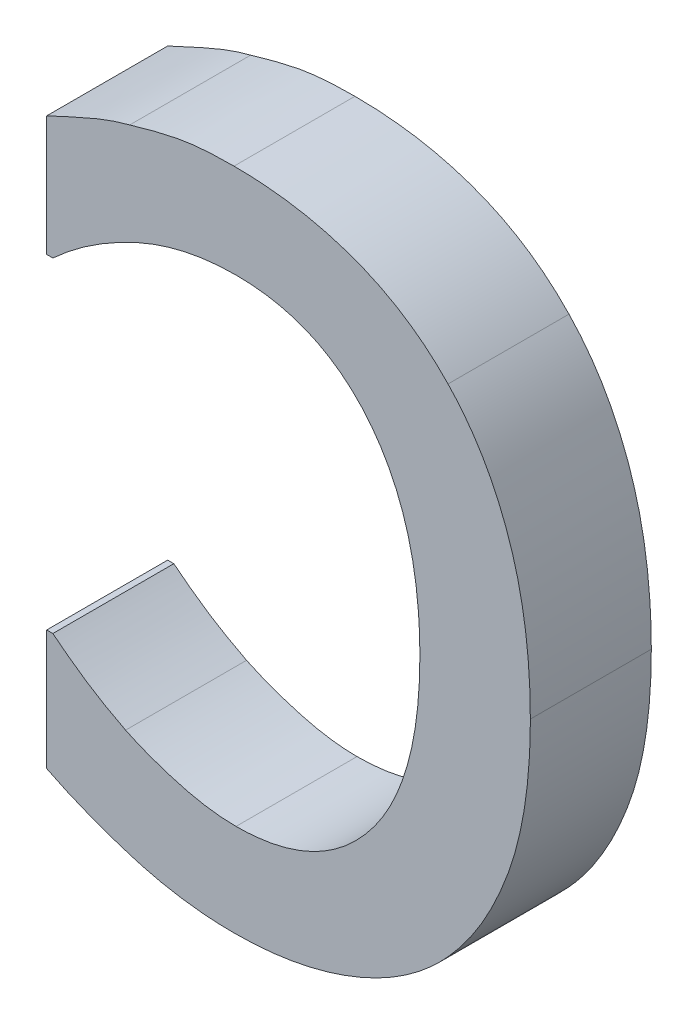
ISO-10303-21;
HEADER;
FILE_DESCRIPTION(('STEP AP214'),'2;1');
FILE_NAME('part.step','',(''),(''),'','','');
FILE_SCHEMA(('AUTOMOTIVE_DESIGN { 1 0 10303 214 1 1 1 1 }'));
ENDSEC;
DATA;
#1=APPLICATION_CONTEXT('core data for automotive mechanical design processes');
#2=APPLICATION_PROTOCOL_DEFINITION('international standard','automotive_design',2000,#1);
#3=PRODUCT_CONTEXT('',#1,'mechanical');
#4=PRODUCT('Part','Part','',(#3));
#5=PRODUCT_RELATED_PRODUCT_CATEGORY('part','',(#4));
#6=PRODUCT_DEFINITION_FORMATION('','',#4);
#7=PRODUCT_DEFINITION_CONTEXT('part definition',#1,'design');
#8=PRODUCT_DEFINITION('design','',#6,#7);
#9=PRODUCT_DEFINITION_SHAPE('','',#8);
#10=(LENGTH_UNIT() NAMED_UNIT(*) SI_UNIT(.MILLI.,.METRE.));
#11=(NAMED_UNIT(*) PLANE_ANGLE_UNIT() SI_UNIT($,.RADIAN.));
#12=(NAMED_UNIT(*) SI_UNIT($,.STERADIAN.) SOLID_ANGLE_UNIT());
#13=UNCERTAINTY_MEASURE_WITH_UNIT(LENGTH_MEASURE(1.E-05),#10,'distance_accuracy_value','');
#14=(GEOMETRIC_REPRESENTATION_CONTEXT(3) GLOBAL_UNCERTAINTY_ASSIGNED_CONTEXT((#13)) GLOBAL_UNIT_ASSIGNED_CONTEXT((#10,
#11,#12)) REPRESENTATION_CONTEXT('',''));
#15=CARTESIAN_POINT('',(0.,0.,0.));
#16=DIRECTION('',(0.,0.,1.));
#17=DIRECTION('',(1.,0.,0.));
#18=AXIS2_PLACEMENT_3D('',#15,#16,#17);
#19=CARTESIAN_POINT('',(-1.423104974207,1.022916597016,0.));
#20=CARTESIAN_POINT('',(-1.423104974207,1.022916597016,0.1));
#21=CARTESIAN_POINT('',(-1.423104974207,1.09210661708,0.));
#22=CARTESIAN_POINT('',(-1.423104974207,1.09210661708,0.1));
#23=CARTESIAN_POINT('',(-1.458834246864,1.195324515865,0.));
#24=CARTESIAN_POINT('',(-1.458834246864,1.195324515865,0.1));
#25=CARTESIAN_POINT('',(-1.491160731648,1.228785263273,0.));
#26=CARTESIAN_POINT('',(-1.491160731648,1.228785263273,0.1));
#27=B_SPLINE_SURFACE_WITH_KNOTS('',2,1,((#19,#20),(#21,#22),(#23,#24),(#25,#26)),.UNSPECIFIED.,
.F.,.F.,.F.,(3,1,3),(2,2),(-2.,-1.,0.),(0.,0.01),.UNSPECIFIED.);
#28=CARTESIAN_POINT('',(-1.491160731648,1.228785263273,0.));
#29=CARTESIAN_POINT('',(-1.458834246864,1.195324515865,0.));
#30=CARTESIAN_POINT('',(-1.423104974207,1.09210661708,0.));
#31=CARTESIAN_POINT('',(-1.423104974207,1.022916597016,0.));
#32=B_SPLINE_CURVE_WITH_KNOTS('',2,(#28,#29,#30,#31),.UNSPECIFIED.,.F.,.F.,(3,1,3),(0.,1.,2.),.UNSPECIFIED.);
#33=CARTESIAN_POINT('',(-1.491160731648,1.228785263273,0.));
#34=VERTEX_POINT('',#33);
#35=CARTESIAN_POINT('',(-1.423104974207,1.022916597016,0.));
#36=VERTEX_POINT('',#35);
#37=EDGE_CURVE('E11',#34,#36,#32,.T.);
#38=DIRECTION('',(0.,0.,1.));
#39=VECTOR('',#38,1.);
#40=CARTESIAN_POINT('',(-1.491160731648,1.228785263273,0.));
#41=LINE('',#40,#39);
#42=CARTESIAN_POINT('',(-1.491160731648,1.228785263273,0.1));
#43=VERTEX_POINT('',#42);
#44=EDGE_CURVE('E28',#34,#43,#41,.T.);
#45=CARTESIAN_POINT('',(-1.423104974207,1.022916597016,0.1));
#46=CARTESIAN_POINT('',(-1.423104974207,1.09210661708,0.1));
#47=CARTESIAN_POINT('',(-1.458834246864,1.195324515865,0.1));
#48=CARTESIAN_POINT('',(-1.491160731648,1.228785263273,0.1));
#49=B_SPLINE_CURVE_WITH_KNOTS('',2,(#45,#46,#47,#48),.UNSPECIFIED.,.F.,.F.,(3,1,3),(-2.,-1.,0.),.UNSPECIFIED.);
#50=CARTESIAN_POINT('',(-1.423104974207,1.022916597016,0.1));
#51=VERTEX_POINT('',#50);
#52=EDGE_CURVE('E152',#51,#43,#49,.T.);
#53=DIRECTION('',(0.,0.,1.));
#54=VECTOR('',#53,1.);
#55=CARTESIAN_POINT('',(-1.423104974207,1.022916597016,0.));
#56=LINE('',#55,#54);
#57=EDGE_CURVE('E364',#36,#51,#56,.T.);
#58=ORIENTED_EDGE('',*,*,#37,.F.);
#59=ORIENTED_EDGE('',*,*,#44,.T.);
#60=ORIENTED_EDGE('',*,*,#52,.F.);
#61=ORIENTED_EDGE('',*,*,#57,.F.);
#62=EDGE_LOOP('',(#58,#59,#60,#61));
#63=FACE_BOUND('',#62,.T.);
#64=ADVANCED_FACE('F17',(#63),#27,.T.);
#65=CARTESIAN_POINT('',(-1.491160731648,0.818749324693508,0.));
#66=CARTESIAN_POINT('',(-1.491160731648,0.818749324693508,0.1));
#67=CARTESIAN_POINT('',(-1.459968509488,0.852777203413839,0.));
#68=CARTESIAN_POINT('',(-1.459968509488,0.852777203413839,0.1));
#69=CARTESIAN_POINT('',(-1.423104974207,0.953726576950822,0.));
#70=CARTESIAN_POINT('',(-1.423104974207,0.953726576950822,0.1));
#71=CARTESIAN_POINT('',(-1.423104974207,1.022916597016,0.));
#72=CARTESIAN_POINT('',(-1.423104974207,1.022916597016,0.1));
#73=B_SPLINE_SURFACE_WITH_KNOTS('',2,1,((#65,#66),(#67,#68),(#69,#70),(#71,#72)),.UNSPECIFIED.,
.F.,.F.,.F.,(3,1,3),(2,2),(-2.,-1.,0.),(0.,0.01),.UNSPECIFIED.);
#74=CARTESIAN_POINT('',(-1.423104974207,1.022916597016,0.));
#75=CARTESIAN_POINT('',(-1.423104974207,0.953726576950822,0.));
#76=CARTESIAN_POINT('',(-1.459968509488,0.852777203413839,0.));
#77=CARTESIAN_POINT('',(-1.491160731648,0.818749324693508,0.));
#78=B_SPLINE_CURVE_WITH_KNOTS('',2,(#74,#75,#76,#77),.UNSPECIFIED.,.F.,.F.,(3,1,3),(0.,1.,2.),.UNSPECIFIED.);
#79=CARTESIAN_POINT('',(-1.491160731648,0.818749324693508,0.));
#80=VERTEX_POINT('',#79);
#81=EDGE_CURVE('E357',#36,#80,#78,.T.);
#82=CARTESIAN_POINT('',(-1.491160731648,0.818749324693508,0.1));
#83=CARTESIAN_POINT('',(-1.459968509488,0.852777203413839,0.1));
#84=CARTESIAN_POINT('',(-1.423104974207,0.953726576950822,0.1));
#85=CARTESIAN_POINT('',(-1.423104974207,1.022916597016,0.1));
#86=B_SPLINE_CURVE_WITH_KNOTS('',2,(#82,#83,#84,#85),.UNSPECIFIED.,.F.,.F.,(3,1,3),(-2.,-1.,0.),.UNSPECIFIED.);
#87=CARTESIAN_POINT('',(-1.491160731648,0.818749324693508,0.1));
#88=VERTEX_POINT('',#87);
#89=EDGE_CURVE('E353',#88,#51,#86,.T.);
#90=DIRECTION('',(0.,0.,1.));
#91=VECTOR('',#90,1.);
#92=CARTESIAN_POINT('',(-1.491160731648,0.818749324693508,0.));
#93=LINE('',#92,#91);
#94=EDGE_CURVE('E347',#80,#88,#93,.T.);
#95=ORIENTED_EDGE('',*,*,#81,.F.);
#96=ORIENTED_EDGE('',*,*,#57,.T.);
#97=ORIENTED_EDGE('',*,*,#89,.F.);
#98=ORIENTED_EDGE('',*,*,#94,.F.);
#99=EDGE_LOOP('',(#95,#96,#97,#98));
#100=FACE_BOUND('',#99,.T.);
#101=ADVANCED_FACE('F426',(#100),#73,.T.);
#102=CARTESIAN_POINT('',(-1.668105700994,0.747290779380812,0.));
#103=CARTESIAN_POINT('',(-1.668105700994,0.747290779380812,0.1));
#104=CARTESIAN_POINT('',(-1.614795357665,0.747290779380812,0.));
#105=CARTESIAN_POINT('',(-1.614795357665,0.747290779380812,0.1));
#106=CARTESIAN_POINT('',(-1.522352953808,0.784154314661171,0.));
#107=CARTESIAN_POINT('',(-1.522352953808,0.784154314661171,0.1));
#108=CARTESIAN_POINT('',(-1.491160731648,0.818749324693508,0.));
#109=CARTESIAN_POINT('',(-1.491160731648,0.818749324693508,0.1));
#110=B_SPLINE_SURFACE_WITH_KNOTS('',2,1,((#102,#103),(#104,#105),(#106,#107),(#108,#109)),
.UNSPECIFIED.,.F.,.F.,.F.,(3,1,3),(2,2),(-2.,-1.,0.),(0.,0.01),.UNSPECIFIED.);
#111=CARTESIAN_POINT('',(-1.491160731648,0.818749324693508,0.));
#112=CARTESIAN_POINT('',(-1.522352953808,0.784154314661171,0.));
#113=CARTESIAN_POINT('',(-1.614795357665,0.747290779380812,0.));
#114=CARTESIAN_POINT('',(-1.668105700994,0.747290779380812,0.));
#115=B_SPLINE_CURVE_WITH_KNOTS('',2,(#111,#112,#113,#114),.UNSPECIFIED.,.F.,.F.,(3,1,3),(0.,1.,
2.),.UNSPECIFIED.);
#116=CARTESIAN_POINT('',(-1.668105700994,0.747290779380812,0.));
#117=VERTEX_POINT('',#116);
#118=EDGE_CURVE('E340',#80,#117,#115,.T.);
#119=CARTESIAN_POINT('',(-1.668105700994,0.747290779380812,0.1));
#120=CARTESIAN_POINT('',(-1.614795357665,0.747290779380812,0.1));
#121=CARTESIAN_POINT('',(-1.522352953808,0.784154314661171,0.1));
#122=CARTESIAN_POINT('',(-1.491160731648,0.818749324693508,0.1));
#123=B_SPLINE_CURVE_WITH_KNOTS('',2,(#119,#120,#121,#122),.UNSPECIFIED.,.F.,.F.,(3,1,3),(-2.,
-1.,0.),.UNSPECIFIED.);
#124=CARTESIAN_POINT('',(-1.668105700994,0.747290779380812,0.1));
#125=VERTEX_POINT('',#124);
#126=EDGE_CURVE('E335',#125,#88,#123,.T.);
#127=DIRECTION('',(0.,0.,1.));
#128=VECTOR('',#127,1.);
#129=CARTESIAN_POINT('',(-1.668105700994,0.747290779380812,0.));
#130=LINE('',#129,#128);
#131=EDGE_CURVE('E329',#117,#125,#130,.T.);
#132=ORIENTED_EDGE('',*,*,#118,.F.);
#133=ORIENTED_EDGE('',*,*,#94,.T.);
#134=ORIENTED_EDGE('',*,*,#126,.F.);
#135=ORIENTED_EDGE('',*,*,#131,.F.);
#136=EDGE_LOOP('',(#132,#133,#134,#135));
#137=FACE_BOUND('',#136,.T.);
#138=ADVANCED_FACE('F422',(#137),#110,.T.);
#139=CARTESIAN_POINT('',(-1.822932549171,0.787557102533204,0.));
#140=CARTESIAN_POINT('',(-1.822932549171,0.787557102533204,0.1));
#141=CARTESIAN_POINT('',(-1.791740327011,0.771677425797049,0.));
#142=CARTESIAN_POINT('',(-1.791740327011,0.771677425797049,0.1));
#143=CARTESIAN_POINT('',(-1.711207680706,0.747290779380812,0.));
#144=CARTESIAN_POINT('',(-1.711207680706,0.747290779380812,0.1));
#145=CARTESIAN_POINT('',(-1.668105700994,0.747290779380812,0.));
#146=CARTESIAN_POINT('',(-1.668105700994,0.747290779380812,0.1));
#147=B_SPLINE_SURFACE_WITH_KNOTS('',2,1,((#139,#140),(#141,#142),(#143,#144),(#145,#146)),
.UNSPECIFIED.,.F.,.F.,.F.,(3,1,3),(2,2),(-2.,-1.,0.),(0.,0.01),.UNSPECIFIED.);
#148=CARTESIAN_POINT('',(-1.668105700994,0.747290779380812,0.));
#149=CARTESIAN_POINT('',(-1.711207680706,0.747290779380812,0.));
#150=CARTESIAN_POINT('',(-1.791740327011,0.771677425797049,0.));
#151=CARTESIAN_POINT('',(-1.822932549171,0.787557102533204,0.));
#152=B_SPLINE_CURVE_WITH_KNOTS('',2,(#148,#149,#150,#151),.UNSPECIFIED.,.F.,.F.,(3,1,3),(0.,1.,
2.),.UNSPECIFIED.);
#153=CARTESIAN_POINT('',(-1.822932549171,0.787557102533204,0.));
#154=VERTEX_POINT('',#153);
#155=EDGE_CURVE('E322',#117,#154,#152,.T.);
#156=CARTESIAN_POINT('',(-1.822932549171,0.787557102533204,0.1));
#157=CARTESIAN_POINT('',(-1.791740327011,0.771677425797049,0.1));
#158=CARTESIAN_POINT('',(-1.711207680706,0.747290779380812,0.1));
#159=CARTESIAN_POINT('',(-1.668105700994,0.747290779380812,0.1));
#160=B_SPLINE_CURVE_WITH_KNOTS('',2,(#156,#157,#158,#159),.UNSPECIFIED.,.F.,.F.,(3,1,3),(-2.,
-1.,0.),.UNSPECIFIED.);
#161=CARTESIAN_POINT('',(-1.822932549171,0.787557102533204,0.1));
#162=VERTEX_POINT('',#161);
#163=EDGE_CURVE('E317',#162,#125,#160,.T.);
#164=DIRECTION('',(0.,0.,1.));
#165=VECTOR('',#164,1.);
#166=CARTESIAN_POINT('',(-1.822932549171,0.787557102533204,0.));
#167=LINE('',#166,#165);
#168=EDGE_CURVE('E314',#154,#162,#167,.T.);
#169=ORIENTED_EDGE('',*,*,#155,.F.);
#170=ORIENTED_EDGE('',*,*,#131,.T.);
#171=ORIENTED_EDGE('',*,*,#163,.F.);
#172=ORIENTED_EDGE('',*,*,#168,.F.);
#173=EDGE_LOOP('',(#169,#170,#171,#172));
#174=FACE_BOUND('',#173,.T.);
#175=ADVANCED_FACE('F418',(#174),#147,.T.);
#176=CARTESIAN_POINT('',(-1.822932549171,0.886805082134171,0.));
#177=DIRECTION('',(-1.,0.,0.));
#178=DIRECTION('',(0.,-1.,0.));
#179=AXIS2_PLACEMENT_3D('',#176,#177,#178);
#180=PLANE('',#179);
#181=DIRECTION('',(0.,1.,0.));
#182=VECTOR('',#181,1.);
#183=CARTESIAN_POINT('',(-1.822932549171,0.787557102533204,0.));
#184=LINE('',#183,#182);
#185=CARTESIAN_POINT('',(-1.822932549171,0.886805082134171,0.));
#186=VERTEX_POINT('',#185);
#187=EDGE_CURVE('E312',#154,#186,#184,.T.);
#188=ORIENTED_EDGE('',*,*,#187,.F.);
#189=ORIENTED_EDGE('',*,*,#168,.T.);
#190=DIRECTION('',(0.,-1.,0.));
#191=VECTOR('',#190,1.);
#192=CARTESIAN_POINT('',(-1.822932549171,0.787557102533204,0.1));
#193=LINE('',#192,#191);
#194=CARTESIAN_POINT('',(-1.822932549171,0.886805082134171,0.1));
#195=VERTEX_POINT('',#194);
#196=EDGE_CURVE('E309',#195,#162,#193,.T.);
#197=ORIENTED_EDGE('',*,*,#196,.F.);
#198=DIRECTION('',(0.,0.,1.));
#199=VECTOR('',#198,1.);
#200=CARTESIAN_POINT('',(-1.822932549171,0.886805082134171,0.));
#201=LINE('',#200,#199);
#202=EDGE_CURVE('E306',#186,#195,#201,.T.);
#203=ORIENTED_EDGE('',*,*,#202,.F.);
#204=EDGE_LOOP('',(#188,#189,#197,#203));
#205=FACE_BOUND('',#204,.T.);
#206=ADVANCED_FACE('F414',(#205),#180,.T.);
#207=CARTESIAN_POINT('',(-1.817828367363,0.886805082134171,0.));
#208=DIRECTION('',(0.,1.,0.));
#209=DIRECTION('',(-1.,0.,0.));
#210=AXIS2_PLACEMENT_3D('',#207,#208,#209);
#211=PLANE('',#210);
#212=DIRECTION('',(1.,0.,0.));
#213=VECTOR('',#212,1.);
#214=CARTESIAN_POINT('',(-1.822932549171,0.886805082134171,0.));
#215=LINE('',#214,#213);
#216=CARTESIAN_POINT('',(-1.817828367363,0.886805082134171,0.));
#217=VERTEX_POINT('',#216);
#218=EDGE_CURVE('E304',#186,#217,#215,.T.);
#219=ORIENTED_EDGE('',*,*,#218,.F.);
#220=ORIENTED_EDGE('',*,*,#202,.T.);
#221=DIRECTION('',(-1.,0.,0.));
#222=VECTOR('',#221,1.);
#223=CARTESIAN_POINT('',(-1.822932549171,0.886805082134171,0.1));
#224=LINE('',#223,#222);
#225=CARTESIAN_POINT('',(-1.817828367363,0.886805082134171,0.1));
#226=VERTEX_POINT('',#225);
#227=EDGE_CURVE('E301',#226,#195,#224,.T.);
#228=ORIENTED_EDGE('',*,*,#227,.F.);
#229=DIRECTION('',(0.,0.,1.));
#230=VECTOR('',#229,1.);
#231=CARTESIAN_POINT('',(-1.817828367363,0.886805082134171,0.));
#232=LINE('',#231,#230);
#233=EDGE_CURVE('E295',#217,#226,#232,.T.);
#234=ORIENTED_EDGE('',*,*,#233,.F.);
#235=EDGE_LOOP('',(#219,#220,#228,#234));
#236=FACE_BOUND('',#235,.T.);
#237=ADVANCED_FACE('F410',(#236),#211,.T.);
#238=CARTESIAN_POINT('',(-1.75771244829,0.847673021605789,0.));
#239=CARTESIAN_POINT('',(-1.75771244829,0.847673021605789,0.1));
#240=CARTESIAN_POINT('',(-1.778696306835,0.858448516533894,0.));
#241=CARTESIAN_POINT('',(-1.778696306835,0.858448516533894,0.1));
#242=CARTESIAN_POINT('',(-1.808187135059,0.878865243766093,0.));
#243=CARTESIAN_POINT('',(-1.808187135059,0.878865243766093,0.1));
#244=CARTESIAN_POINT('',(-1.817828367363,0.886805082134171,0.));
#245=CARTESIAN_POINT('',(-1.817828367363,0.886805082134171,0.1));
#246=B_SPLINE_SURFACE_WITH_KNOTS('',2,1,((#238,#239),(#240,#241),(#242,#243),(#244,#245)),
.UNSPECIFIED.,.F.,.F.,.F.,(3,1,3),(2,2),(-2.,-1.,0.),(0.,0.01),.UNSPECIFIED.);
#247=CARTESIAN_POINT('',(-1.817828367363,0.886805082134171,0.));
#248=CARTESIAN_POINT('',(-1.808187135059,0.878865243766093,0.));
#249=CARTESIAN_POINT('',(-1.778696306835,0.858448516533894,0.));
#250=CARTESIAN_POINT('',(-1.75771244829,0.847673021605789,0.));
#251=B_SPLINE_CURVE_WITH_KNOTS('',2,(#247,#248,#249,#250),.UNSPECIFIED.,.F.,.F.,(3,1,3),(0.,1.,
2.),.UNSPECIFIED.);
#252=CARTESIAN_POINT('',(-1.75771244829,0.847673021605789,0.));
#253=VERTEX_POINT('',#252);
#254=EDGE_CURVE('E288',#217,#253,#251,.T.);
#255=CARTESIAN_POINT('',(-1.75771244829,0.847673021605789,0.1));
#256=CARTESIAN_POINT('',(-1.778696306835,0.858448516533894,0.1));
#257=CARTESIAN_POINT('',(-1.808187135059,0.878865243766093,0.1));
#258=CARTESIAN_POINT('',(-1.817828367363,0.886805082134171,0.1));
#259=B_SPLINE_CURVE_WITH_KNOTS('',2,(#255,#256,#257,#258),.UNSPECIFIED.,.F.,.F.,(3,1,3),(-2.,
-1.,0.),.UNSPECIFIED.);
#260=CARTESIAN_POINT('',(-1.75771244829,0.847673021605789,0.1));
#261=VERTEX_POINT('',#260);
#262=EDGE_CURVE('E283',#261,#226,#259,.T.);
#263=DIRECTION('',(0.,0.,1.));
#264=VECTOR('',#263,1.);
#265=CARTESIAN_POINT('',(-1.75771244829,0.847673021605789,0.));
#266=LINE('',#265,#264);
#267=EDGE_CURVE('E277',#253,#261,#266,.T.);
#268=ORIENTED_EDGE('',*,*,#254,.F.);
#269=ORIENTED_EDGE('',*,*,#233,.T.);
#270=ORIENTED_EDGE('',*,*,#262,.F.);
#271=ORIENTED_EDGE('',*,*,#267,.F.);
#272=EDGE_LOOP('',(#268,#269,#270,#271));
#273=FACE_BOUND('',#272,.T.);
#274=ADVANCED_FACE('F406',(#273),#246,.T.);
#275=CARTESIAN_POINT('',(-1.666404307058,0.824420637813563,0.));
#276=CARTESIAN_POINT('',(-1.666404307058,0.824420637813563,0.1));
#277=CARTESIAN_POINT('',(-1.689089559538,0.824420637813563,0.));
#278=CARTESIAN_POINT('',(-1.689089559538,0.824420637813563,0.1));
#279=CARTESIAN_POINT('',(-1.738997114994,0.838598920613701,0.));
#280=CARTESIAN_POINT('',(-1.738997114994,0.838598920613701,0.1));
#281=CARTESIAN_POINT('',(-1.75771244829,0.847673021605789,0.));
#282=CARTESIAN_POINT('',(-1.75771244829,0.847673021605789,0.1));
#283=B_SPLINE_SURFACE_WITH_KNOTS('',2,1,((#275,#276),(#277,#278),(#279,#280),(#281,#282)),
.UNSPECIFIED.,.F.,.F.,.F.,(3,1,3),(2,2),(-2.,-1.,0.),(0.,0.01),.UNSPECIFIED.);
#284=CARTESIAN_POINT('',(-1.75771244829,0.847673021605789,0.));
#285=CARTESIAN_POINT('',(-1.738997114994,0.838598920613701,0.));
#286=CARTESIAN_POINT('',(-1.689089559538,0.824420637813563,0.));
#287=CARTESIAN_POINT('',(-1.666404307058,0.824420637813563,0.));
#288=B_SPLINE_CURVE_WITH_KNOTS('',2,(#284,#285,#286,#287),.UNSPECIFIED.,.F.,.F.,(3,1,3),(0.,1.,
2.),.UNSPECIFIED.);
#289=CARTESIAN_POINT('',(-1.666404307058,0.824420637813563,0.));
#290=VERTEX_POINT('',#289);
#291=EDGE_CURVE('E270',#253,#290,#288,.T.);
#292=CARTESIAN_POINT('',(-1.666404307058,0.824420637813563,0.1));
#293=CARTESIAN_POINT('',(-1.689089559538,0.824420637813563,0.1));
#294=CARTESIAN_POINT('',(-1.738997114994,0.838598920613701,0.1));
#295=CARTESIAN_POINT('',(-1.75771244829,0.847673021605789,0.1));
#296=B_SPLINE_CURVE_WITH_KNOTS('',2,(#292,#293,#294,#295),.UNSPECIFIED.,.F.,.F.,(3,1,3),(-2.,
-1.,0.),.UNSPECIFIED.);
#297=CARTESIAN_POINT('',(-1.666404307058,0.824420637813563,0.1));
#298=VERTEX_POINT('',#297);
#299=EDGE_CURVE('E265',#298,#261,#296,.T.);
#300=DIRECTION('',(0.,0.,1.));
#301=VECTOR('',#300,1.);
#302=CARTESIAN_POINT('',(-1.666404307058,0.824420637813563,0.));
#303=LINE('',#302,#301);
#304=EDGE_CURVE('E259',#290,#298,#303,.T.);
#305=ORIENTED_EDGE('',*,*,#291,.F.);
#306=ORIENTED_EDGE('',*,*,#267,.T.);
#307=ORIENTED_EDGE('',*,*,#299,.F.);
#308=ORIENTED_EDGE('',*,*,#304,.F.);
#309=EDGE_LOOP('',(#305,#306,#307,#308));
#310=FACE_BOUND('',#309,.T.);
#311=ADVANCED_FACE('F402',(#310),#283,.T.);
#312=CARTESIAN_POINT('',(-1.51441311544,1.022916597016,0.));
#313=CARTESIAN_POINT('',(-1.51441311544,1.022916597016,0.1));
#314=CARTESIAN_POINT('',(-1.51441311544,0.928205667910574,0.));
#315=CARTESIAN_POINT('',(-1.51441311544,0.928205667910574,0.1));
#316=CARTESIAN_POINT('',(-1.597781418305,0.824420637813563,0.));
#317=CARTESIAN_POINT('',(-1.597781418305,0.824420637813563,0.1));
#318=CARTESIAN_POINT('',(-1.666404307058,0.824420637813563,0.));
#319=CARTESIAN_POINT('',(-1.666404307058,0.824420637813563,0.1));
#320=B_SPLINE_SURFACE_WITH_KNOTS('',2,1,((#312,#313),(#314,#315),(#316,#317),(#318,#319)),
.UNSPECIFIED.,.F.,.F.,.F.,(3,1,3),(2,2),(-2.,-1.,0.),(0.,0.01),.UNSPECIFIED.);
#321=CARTESIAN_POINT('',(-1.666404307058,0.824420637813563,0.));
#322=CARTESIAN_POINT('',(-1.597781418305,0.824420637813563,0.));
#323=CARTESIAN_POINT('',(-1.51441311544,0.928205667910574,0.));
#324=CARTESIAN_POINT('',(-1.51441311544,1.022916597016,0.));
#325=B_SPLINE_CURVE_WITH_KNOTS('',2,(#321,#322,#323,#324),.UNSPECIFIED.,.F.,.F.,(3,1,3),(0.,1.,
2.),.UNSPECIFIED.);
#326=CARTESIAN_POINT('',(-1.51441311544,1.022916597016,0.));
#327=VERTEX_POINT('',#326);
#328=EDGE_CURVE('E252',#290,#327,#325,.T.);
#329=CARTESIAN_POINT('',(-1.51441311544,1.022916597016,0.1));
#330=CARTESIAN_POINT('',(-1.51441311544,0.928205667910574,0.1));
#331=CARTESIAN_POINT('',(-1.597781418305,0.824420637813563,0.1));
#332=CARTESIAN_POINT('',(-1.666404307058,0.824420637813563,0.1));
#333=B_SPLINE_CURVE_WITH_KNOTS('',2,(#329,#330,#331,#332),.UNSPECIFIED.,.F.,.F.,(3,1,3),(-2.,
-1.,0.),.UNSPECIFIED.);
#334=CARTESIAN_POINT('',(-1.51441311544,1.022916597016,0.1));
#335=VERTEX_POINT('',#334);
#336=EDGE_CURVE('E247',#335,#298,#333,.T.);
#337=DIRECTION('',(0.,0.,1.));
#338=VECTOR('',#337,1.);
#339=CARTESIAN_POINT('',(-1.51441311544,1.022916597016,0.));
#340=LINE('',#339,#338);
#341=EDGE_CURVE('E241',#327,#335,#340,.T.);
#342=ORIENTED_EDGE('',*,*,#328,.F.);
#343=ORIENTED_EDGE('',*,*,#304,.T.);
#344=ORIENTED_EDGE('',*,*,#336,.F.);
#345=ORIENTED_EDGE('',*,*,#341,.F.);
#346=EDGE_LOOP('',(#342,#343,#344,#345));
#347=FACE_BOUND('',#346,.T.);
#348=ADVANCED_FACE('F398',(#347),#320,.T.);
#349=CARTESIAN_POINT('',(-1.666404307058,1.219144030969,0.));
#350=CARTESIAN_POINT('',(-1.666404307058,1.219144030969,0.1));
#351=CARTESIAN_POINT('',(-1.594945761745,1.219144030969,0.));
#352=CARTESIAN_POINT('',(-1.594945761745,1.219144030969,0.1));
#353=CARTESIAN_POINT('',(-1.51441311544,1.115359000872,0.));
#354=CARTESIAN_POINT('',(-1.51441311544,1.115359000872,0.1));
#355=CARTESIAN_POINT('',(-1.51441311544,1.022916597016,0.));
#356=CARTESIAN_POINT('',(-1.51441311544,1.022916597016,0.1));
#357=B_SPLINE_SURFACE_WITH_KNOTS('',2,1,((#349,#350),(#351,#352),(#353,#354),(#355,#356)),
.UNSPECIFIED.,.F.,.F.,.F.,(3,1,3),(2,2),(-2.,-1.,0.),(0.,0.01),.UNSPECIFIED.);
#358=CARTESIAN_POINT('',(-1.51441311544,1.022916597016,0.));
#359=CARTESIAN_POINT('',(-1.51441311544,1.115359000872,0.));
#360=CARTESIAN_POINT('',(-1.594945761745,1.219144030969,0.));
#361=CARTESIAN_POINT('',(-1.666404307058,1.219144030969,0.));
#362=B_SPLINE_CURVE_WITH_KNOTS('',2,(#358,#359,#360,#361),.UNSPECIFIED.,.F.,.F.,(3,1,3),(0.,1.,
2.),.UNSPECIFIED.);
#363=CARTESIAN_POINT('',(-1.666404307058,1.219144030969,0.));
#364=VERTEX_POINT('',#363);
#365=EDGE_CURVE('E234',#327,#364,#362,.T.);
#366=CARTESIAN_POINT('',(-1.666404307058,1.219144030969,0.1));
#367=CARTESIAN_POINT('',(-1.594945761745,1.219144030969,0.1));
#368=CARTESIAN_POINT('',(-1.51441311544,1.115359000872,0.1));
#369=CARTESIAN_POINT('',(-1.51441311544,1.022916597016,0.1));
#370=B_SPLINE_CURVE_WITH_KNOTS('',2,(#366,#367,#368,#369),.UNSPECIFIED.,.F.,.F.,(3,1,3),(-2.,
-1.,0.),.UNSPECIFIED.);
#371=CARTESIAN_POINT('',(-1.666404307058,1.219144030969,0.1));
#372=VERTEX_POINT('',#371);
#373=EDGE_CURVE('E229',#372,#335,#370,.T.);
#374=DIRECTION('',(0.,0.,1.));
#375=VECTOR('',#374,1.);
#376=CARTESIAN_POINT('',(-1.666404307058,1.219144030969,0.));
#377=LINE('',#376,#375);
#378=EDGE_CURVE('E223',#364,#372,#377,.T.);
#379=ORIENTED_EDGE('',*,*,#365,.F.);
#380=ORIENTED_EDGE('',*,*,#341,.T.);
#381=ORIENTED_EDGE('',*,*,#373,.F.);
#382=ORIENTED_EDGE('',*,*,#378,.F.);
#383=EDGE_LOOP('',(#379,#380,#381,#382));
#384=FACE_BOUND('',#383,.T.);
#385=ADVANCED_FACE('F394',(#384),#357,.T.);
#386=CARTESIAN_POINT('',(-1.817828367363,1.155625324025,0.));
#387=CARTESIAN_POINT('',(-1.817828367363,1.155625324025,0.1));
#388=CARTESIAN_POINT('',(-1.787770407827,1.183414758313,0.));
#389=CARTESIAN_POINT('',(-1.787770407827,1.183414758313,0.1));
#390=CARTESIAN_POINT('',(-1.70950628677,1.219144030969,0.));
#391=CARTESIAN_POINT('',(-1.70950628677,1.219144030969,0.1));
#392=CARTESIAN_POINT('',(-1.666404307058,1.219144030969,0.));
#393=CARTESIAN_POINT('',(-1.666404307058,1.219144030969,0.1));
#394=B_SPLINE_SURFACE_WITH_KNOTS('',2,1,((#386,#387),(#388,#389),(#390,#391),(#392,#393)),
.UNSPECIFIED.,.F.,.F.,.F.,(3,1,3),(2,2),(-2.,-1.,0.),(0.,0.01),.UNSPECIFIED.);
#395=CARTESIAN_POINT('',(-1.666404307058,1.219144030969,0.));
#396=CARTESIAN_POINT('',(-1.70950628677,1.219144030969,0.));
#397=CARTESIAN_POINT('',(-1.787770407827,1.183414758313,0.));
#398=CARTESIAN_POINT('',(-1.817828367363,1.155625324025,0.));
#399=B_SPLINE_CURVE_WITH_KNOTS('',2,(#395,#396,#397,#398),.UNSPECIFIED.,.F.,.F.,(3,1,3),(0.,1.,
2.),.UNSPECIFIED.);
#400=CARTESIAN_POINT('',(-1.817828367363,1.155625324025,0.));
#401=VERTEX_POINT('',#400);
#402=EDGE_CURVE('E216',#364,#401,#399,.T.);
#403=CARTESIAN_POINT('',(-1.817828367363,1.155625324025,0.1));
#404=CARTESIAN_POINT('',(-1.787770407827,1.183414758313,0.1));
#405=CARTESIAN_POINT('',(-1.70950628677,1.219144030969,0.1));
#406=CARTESIAN_POINT('',(-1.666404307058,1.219144030969,0.1));
#407=B_SPLINE_CURVE_WITH_KNOTS('',2,(#403,#404,#405,#406),.UNSPECIFIED.,.F.,.F.,(3,1,3),(-2.,
-1.,0.),.UNSPECIFIED.);
#408=CARTESIAN_POINT('',(-1.817828367363,1.155625324025,0.1));
#409=VERTEX_POINT('',#408);
#410=EDGE_CURVE('E211',#409,#372,#407,.T.);
#411=DIRECTION('',(0.,0.,1.));
#412=VECTOR('',#411,1.);
#413=CARTESIAN_POINT('',(-1.817828367363,1.155625324025,0.));
#414=LINE('',#413,#412);
#415=EDGE_CURVE('E208',#401,#409,#414,.T.);
#416=ORIENTED_EDGE('',*,*,#402,.F.);
#417=ORIENTED_EDGE('',*,*,#378,.T.);
#418=ORIENTED_EDGE('',*,*,#410,.F.);
#419=ORIENTED_EDGE('',*,*,#415,.F.);
#420=EDGE_LOOP('',(#416,#417,#418,#419));
#421=FACE_BOUND('',#420,.T.);
#422=ADVANCED_FACE('F390',(#421),#394,.T.);
#423=CARTESIAN_POINT('',(-1.822932549171,1.155625324025,0.));
#424=DIRECTION('',(0.,-1.,0.));
#425=DIRECTION('',(1.,0.,0.));
#426=AXIS2_PLACEMENT_3D('',#423,#424,#425);
#427=PLANE('',#426);
#428=DIRECTION('',(-1.,0.,0.));
#429=VECTOR('',#428,1.);
#430=CARTESIAN_POINT('',(-1.817828367363,1.155625324025,0.));
#431=LINE('',#430,#429);
#432=CARTESIAN_POINT('',(-1.822932549171,1.155625324025,0.));
#433=VERTEX_POINT('',#432);
#434=EDGE_CURVE('E206',#401,#433,#431,.T.);
#435=ORIENTED_EDGE('',*,*,#434,.F.);
#436=ORIENTED_EDGE('',*,*,#415,.T.);
#437=DIRECTION('',(1.,0.,0.));
#438=VECTOR('',#437,1.);
#439=CARTESIAN_POINT('',(-1.817828367363,1.155625324025,0.1));
#440=LINE('',#439,#438);
#441=CARTESIAN_POINT('',(-1.822932549171,1.155625324025,0.1));
#442=VERTEX_POINT('',#441);
#443=EDGE_CURVE('E203',#442,#409,#440,.T.);
#444=ORIENTED_EDGE('',*,*,#443,.F.);
#445=DIRECTION('',(0.,0.,1.));
#446=VECTOR('',#445,1.);
#447=CARTESIAN_POINT('',(-1.822932549171,1.155625324025,0.));
#448=LINE('',#447,#446);
#449=EDGE_CURVE('E200',#433,#442,#448,.T.);
#450=ORIENTED_EDGE('',*,*,#449,.F.);
#451=EDGE_LOOP('',(#435,#436,#444,#450));
#452=FACE_BOUND('',#451,.T.);
#453=ADVANCED_FACE('F386',(#452),#427,.T.);
#454=CARTESIAN_POINT('',(-1.822932549171,1.254873303626,0.));
#455=DIRECTION('',(-1.,0.,0.));
#456=DIRECTION('',(0.,-1.,0.));
#457=AXIS2_PLACEMENT_3D('',#454,#455,#456);
#458=PLANE('',#457);
#459=DIRECTION('',(0.,1.,0.));
#460=VECTOR('',#459,1.);
#461=CARTESIAN_POINT('',(-1.822932549171,1.155625324025,0.));
#462=LINE('',#461,#460);
#463=CARTESIAN_POINT('',(-1.822932549171,1.254873303626,0.));
#464=VERTEX_POINT('',#463);
#465=EDGE_CURVE('E198',#433,#464,#462,.T.);
#466=ORIENTED_EDGE('',*,*,#465,.F.);
#467=ORIENTED_EDGE('',*,*,#449,.T.);
#468=DIRECTION('',(0.,-1.,0.));
#469=VECTOR('',#468,1.);
#470=CARTESIAN_POINT('',(-1.822932549171,1.155625324025,0.1));
#471=LINE('',#470,#469);
#472=CARTESIAN_POINT('',(-1.822932549171,1.254873303626,0.1));
#473=VERTEX_POINT('',#472);
#474=EDGE_CURVE('E195',#473,#442,#471,.T.);
#475=ORIENTED_EDGE('',*,*,#474,.F.);
#476=DIRECTION('',(0.,0.,1.));
#477=VECTOR('',#476,1.);
#478=CARTESIAN_POINT('',(-1.822932549171,1.254873303626,0.));
#479=LINE('',#478,#477);
#480=EDGE_CURVE('E189',#464,#473,#479,.T.);
#481=ORIENTED_EDGE('',*,*,#480,.F.);
#482=EDGE_LOOP('',(#466,#467,#475,#481));
#483=FACE_BOUND('',#482,.T.);
#484=ADVANCED_FACE('F382',(#483),#458,.T.);
#485=CARTESIAN_POINT('',(-1.754309660418,1.282662737914,0.));
#486=CARTESIAN_POINT('',(-1.754309660418,1.282662737914,0.1));
#487=CARTESIAN_POINT('',(-1.770189337155,1.27869281873,0.));
#488=CARTESIAN_POINT('',(-1.770189337155,1.27869281873,0.1));
#489=CARTESIAN_POINT('',(-1.809888528995,1.261111748058,0.));
#490=CARTESIAN_POINT('',(-1.809888528995,1.261111748058,0.1));
#491=CARTESIAN_POINT('',(-1.822932549171,1.254873303626,0.));
#492=CARTESIAN_POINT('',(-1.822932549171,1.254873303626,0.1));
#493=B_SPLINE_SURFACE_WITH_KNOTS('',2,1,((#485,#486),(#487,#488),(#489,#490),(#491,#492)),
.UNSPECIFIED.,.F.,.F.,.F.,(3,1,3),(2,2),(-2.,-1.,0.),(0.,0.01),.UNSPECIFIED.);
#494=CARTESIAN_POINT('',(-1.822932549171,1.254873303626,0.));
#495=CARTESIAN_POINT('',(-1.809888528995,1.261111748058,0.));
#496=CARTESIAN_POINT('',(-1.770189337155,1.27869281873,0.));
#497=CARTESIAN_POINT('',(-1.754309660418,1.282662737914,0.));
#498=B_SPLINE_CURVE_WITH_KNOTS('',2,(#494,#495,#496,#497),.UNSPECIFIED.,.F.,.F.,(3,1,3),(0.,1.,
2.),.UNSPECIFIED.);
#499=CARTESIAN_POINT('',(-1.754309660418,1.282662737914,0.));
#500=VERTEX_POINT('',#499);
#501=EDGE_CURVE('E182',#464,#500,#498,.T.);
#502=CARTESIAN_POINT('',(-1.754309660418,1.282662737914,0.1));
#503=CARTESIAN_POINT('',(-1.770189337155,1.27869281873,0.1));
#504=CARTESIAN_POINT('',(-1.809888528995,1.261111748058,0.1));
#505=CARTESIAN_POINT('',(-1.822932549171,1.254873303626,0.1));
#506=B_SPLINE_CURVE_WITH_KNOTS('',2,(#502,#503,#504,#505),.UNSPECIFIED.,.F.,.F.,(3,1,3),(-2.,
-1.,0.),.UNSPECIFIED.);
#507=CARTESIAN_POINT('',(-1.754309660418,1.282662737914,0.1));
#508=VERTEX_POINT('',#507);
#509=EDGE_CURVE('E178',#508,#473,#506,.T.);
#510=DIRECTION('',(0.,0.,1.));
#511=VECTOR('',#510,1.);
#512=CARTESIAN_POINT('',(-1.754309660418,1.282662737914,0.));
#513=LINE('',#512,#511);
#514=EDGE_CURVE('E137',#500,#508,#513,.T.);
#515=ORIENTED_EDGE('',*,*,#501,.F.);
#516=ORIENTED_EDGE('',*,*,#480,.T.);
#517=ORIENTED_EDGE('',*,*,#509,.F.);
#518=ORIENTED_EDGE('',*,*,#514,.F.);
#519=EDGE_LOOP('',(#515,#516,#517,#518));
#520=FACE_BOUND('',#519,.T.);
#521=ADVANCED_FACE('F380',(#520),#493,.T.);
#522=CARTESIAN_POINT('',(-1.668105700994,1.296273889402,0.));
#523=CARTESIAN_POINT('',(-1.668105700994,1.296273889402,0.1));
#524=CARTESIAN_POINT('',(-1.695895135282,1.296273889402,0.));
#525=CARTESIAN_POINT('',(-1.695895135282,1.296273889402,0.1));
#526=CARTESIAN_POINT('',(-1.731624407938,1.289468313658,0.));
#527=CARTESIAN_POINT('',(-1.731624407938,1.289468313658,0.1));
#528=CARTESIAN_POINT('',(-1.754309660418,1.282662737914,0.));
#529=CARTESIAN_POINT('',(-1.754309660418,1.282662737914,0.1));
#530=B_SPLINE_SURFACE_WITH_KNOTS('',2,1,((#522,#523),(#524,#525),(#526,#527),(#528,#529)),
.UNSPECIFIED.,.F.,.F.,.F.,(3,1,3),(2,2),(-2.,-1.,0.),(0.,0.01),.UNSPECIFIED.);
#531=CARTESIAN_POINT('',(-1.754309660418,1.282662737914,0.));
#532=CARTESIAN_POINT('',(-1.731624407938,1.289468313658,0.));
#533=CARTESIAN_POINT('',(-1.695895135282,1.296273889402,0.));
#534=CARTESIAN_POINT('',(-1.668105700994,1.296273889402,0.));
#535=B_SPLINE_CURVE_WITH_KNOTS('',2,(#531,#532,#533,#534),.UNSPECIFIED.,.F.,.F.,(3,1,3),(0.,1.,
2.),.UNSPECIFIED.);
#536=CARTESIAN_POINT('',(-1.668105700994,1.296273889402,0.));
#537=VERTEX_POINT('',#536);
#538=EDGE_CURVE('E141',#500,#537,#535,.T.);
#539=CARTESIAN_POINT('',(-1.668105700994,1.296273889402,0.1));
#540=CARTESIAN_POINT('',(-1.695895135282,1.296273889402,0.1));
#541=CARTESIAN_POINT('',(-1.731624407938,1.289468313658,0.1));
#542=CARTESIAN_POINT('',(-1.754309660418,1.282662737914,0.1));
#543=B_SPLINE_CURVE_WITH_KNOTS('',2,(#539,#540,#541,#542),.UNSPECIFIED.,.F.,.F.,(3,1,3),(-2.,
-1.,0.),.UNSPECIFIED.);
#544=CARTESIAN_POINT('',(-1.668105700994,1.296273889402,0.1));
#545=VERTEX_POINT('',#544);
#546=EDGE_CURVE('E130',#545,#508,#543,.T.);
#547=DIRECTION('',(0.,0.,1.));
#548=VECTOR('',#547,1.);
#549=CARTESIAN_POINT('',(-1.668105700994,1.296273889402,0.));
#550=LINE('',#549,#548);
#551=EDGE_CURVE('E134',#537,#545,#550,.T.);
#552=ORIENTED_EDGE('',*,*,#538,.F.);
#553=ORIENTED_EDGE('',*,*,#514,.T.);
#554=ORIENTED_EDGE('',*,*,#546,.F.);
#555=ORIENTED_EDGE('',*,*,#551,.F.);
#556=EDGE_LOOP('',(#552,#553,#554,#555));
#557=FACE_BOUND('',#556,.T.);
#558=ADVANCED_FACE('F133',(#557),#530,.T.);
#559=CARTESIAN_POINT('',(-1.491160731648,1.228785263273,0.));
#560=CARTESIAN_POINT('',(-1.491160731648,1.228785263273,0.1));
#561=CARTESIAN_POINT('',(-1.523487216432,1.262813141994,0.));
#562=CARTESIAN_POINT('',(-1.523487216432,1.262813141994,0.1));
#563=CARTESIAN_POINT('',(-1.613661095041,1.296273889402,0.));
#564=CARTESIAN_POINT('',(-1.613661095041,1.296273889402,0.1));
#565=CARTESIAN_POINT('',(-1.668105700994,1.296273889402,0.));
#566=CARTESIAN_POINT('',(-1.668105700994,1.296273889402,0.1));
#567=B_SPLINE_SURFACE_WITH_KNOTS('',2,1,((#559,#560),(#561,#562),(#563,#564),(#565,#566)),
.UNSPECIFIED.,.F.,.F.,.F.,(3,1,3),(2,2),(-2.,-1.,0.),(0.,0.01),.UNSPECIFIED.);
#568=CARTESIAN_POINT('',(-1.668105700994,1.296273889402,0.));
#569=CARTESIAN_POINT('',(-1.613661095041,1.296273889402,0.));
#570=CARTESIAN_POINT('',(-1.523487216432,1.262813141994,0.));
#571=CARTESIAN_POINT('',(-1.491160731648,1.228785263273,0.));
#572=B_SPLINE_CURVE_WITH_KNOTS('',2,(#568,#569,#570,#571),.UNSPECIFIED.,.F.,.F.,(3,1,3),(0.,1.,
2.),.UNSPECIFIED.);
#573=EDGE_CURVE('E147',#537,#34,#572,.T.);
#574=CARTESIAN_POINT('',(-1.491160731648,1.228785263273,0.1));
#575=CARTESIAN_POINT('',(-1.523487216432,1.262813141994,0.1));
#576=CARTESIAN_POINT('',(-1.613661095041,1.296273889402,0.1));
#577=CARTESIAN_POINT('',(-1.668105700994,1.296273889402,0.1));
#578=B_SPLINE_CURVE_WITH_KNOTS('',2,(#574,#575,#576,#577),.UNSPECIFIED.,.F.,.F.,(3,1,3),(-2.,
-1.,0.),.UNSPECIFIED.);
#579=EDGE_CURVE('E146',#43,#545,#578,.T.);
#580=ORIENTED_EDGE('',*,*,#573,.F.);
#581=ORIENTED_EDGE('',*,*,#551,.T.);
#582=ORIENTED_EDGE('',*,*,#579,.F.);
#583=ORIENTED_EDGE('',*,*,#44,.F.);
#584=EDGE_LOOP('',(#580,#581,#582,#583));
#585=FACE_BOUND('',#584,.T.);
#586=ADVANCED_FACE('F145',(#585),#567,.T.);
#587=CARTESIAN_POINT('',(-1.625131079063,1.02233833807,0.));
#588=DIRECTION('',(0.,0.,1.));
#589=DIRECTION('',(1.,0.,0.));
#590=AXIS2_PLACEMENT_3D('',#587,#588,#589);
#591=PLANE('',#590);
#592=ORIENTED_EDGE('',*,*,#573,.T.);
#593=ORIENTED_EDGE('',*,*,#37,.T.);
#594=ORIENTED_EDGE('',*,*,#81,.T.);
#595=ORIENTED_EDGE('',*,*,#118,.T.);
#596=ORIENTED_EDGE('',*,*,#155,.T.);
#597=ORIENTED_EDGE('',*,*,#187,.T.);
#598=ORIENTED_EDGE('',*,*,#218,.T.);
#599=ORIENTED_EDGE('',*,*,#254,.T.);
#600=ORIENTED_EDGE('',*,*,#291,.T.);
#601=ORIENTED_EDGE('',*,*,#328,.T.);
#602=ORIENTED_EDGE('',*,*,#365,.T.);
#603=ORIENTED_EDGE('',*,*,#402,.T.);
#604=ORIENTED_EDGE('',*,*,#434,.T.);
#605=ORIENTED_EDGE('',*,*,#465,.T.);
#606=ORIENTED_EDGE('',*,*,#501,.T.);
#607=ORIENTED_EDGE('',*,*,#538,.T.);
#608=EDGE_LOOP('',(#592,#593,#594,#595,#596,#597,#598,#599,#600,#601,#602,#603,#604,#605,#606,#607));
#609=FACE_BOUND('',#608,.T.);
#610=ADVANCED_FACE('F375',(#609),#591,.F.);
#611=CARTESIAN_POINT('',(-1.625131079063,1.02233833807,0.1));
#612=DIRECTION('',(0.,0.,1.));
#613=DIRECTION('',(1.,0.,0.));
#614=AXIS2_PLACEMENT_3D('',#611,#612,#613);
#615=PLANE('',#614);
#616=ORIENTED_EDGE('',*,*,#579,.T.);
#617=ORIENTED_EDGE('',*,*,#546,.T.);
#618=ORIENTED_EDGE('',*,*,#509,.T.);
#619=ORIENTED_EDGE('',*,*,#474,.T.);
#620=ORIENTED_EDGE('',*,*,#443,.T.);
#621=ORIENTED_EDGE('',*,*,#410,.T.);
#622=ORIENTED_EDGE('',*,*,#373,.T.);
#623=ORIENTED_EDGE('',*,*,#336,.T.);
#624=ORIENTED_EDGE('',*,*,#299,.T.);
#625=ORIENTED_EDGE('',*,*,#262,.T.);
#626=ORIENTED_EDGE('',*,*,#227,.T.);
#627=ORIENTED_EDGE('',*,*,#196,.T.);
#628=ORIENTED_EDGE('',*,*,#163,.T.);
#629=ORIENTED_EDGE('',*,*,#126,.T.);
#630=ORIENTED_EDGE('',*,*,#89,.T.);
#631=ORIENTED_EDGE('',*,*,#52,.T.);
#632=EDGE_LOOP('',(#616,#617,#618,#619,#620,#621,#622,#623,#624,#625,#626,#627,#628,#629,#630,#631));
#633=FACE_BOUND('',#632,.T.);
#634=ADVANCED_FACE('F150',(#633),#615,.T.);
#635=CLOSED_SHELL('',(#64,#101,#138,#175,#206,#237,#274,#311,#348,#385,#422,#453,#484,#521,#558,
#586,#610,#634));
#636=MANIFOLD_SOLID_BREP('B1',#635);
#637=ADVANCED_BREP_SHAPE_REPRESENTATION('',(#18,#636),#14);
#638=SHAPE_DEFINITION_REPRESENTATION(#9,#637);
ENDSEC;
END-ISO-10303-21;
